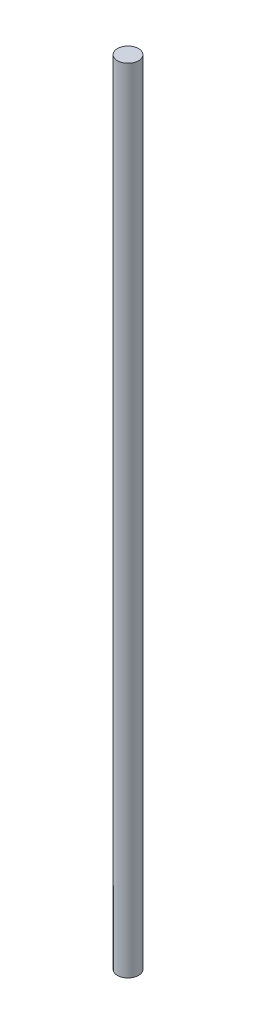
ISO-10303-21;
HEADER;
FILE_DESCRIPTION(('STEP AP214'),'2;1');
FILE_NAME('part.step','',(''),(''),'','','');
FILE_SCHEMA(('AUTOMOTIVE_DESIGN { 1 0 10303 214 1 1 1 1 }'));
ENDSEC;
DATA;
#1=APPLICATION_CONTEXT('core data for automotive mechanical design processes');
#2=APPLICATION_PROTOCOL_DEFINITION('international standard','automotive_design',2000,#1);
#3=PRODUCT_CONTEXT('',#1,'mechanical');
#4=PRODUCT('Part','Part','',(#3));
#5=PRODUCT_RELATED_PRODUCT_CATEGORY('part','',(#4));
#6=PRODUCT_DEFINITION_FORMATION('','',#4);
#7=PRODUCT_DEFINITION_CONTEXT('part definition',#1,'design');
#8=PRODUCT_DEFINITION('design','',#6,#7);
#9=PRODUCT_DEFINITION_SHAPE('','',#8);
#10=(LENGTH_UNIT() NAMED_UNIT(*) SI_UNIT(.MILLI.,.METRE.));
#11=(NAMED_UNIT(*) PLANE_ANGLE_UNIT() SI_UNIT($,.RADIAN.));
#12=(NAMED_UNIT(*) SI_UNIT($,.STERADIAN.) SOLID_ANGLE_UNIT());
#13=UNCERTAINTY_MEASURE_WITH_UNIT(LENGTH_MEASURE(1.E-05),#10,'distance_accuracy_value','');
#14=(GEOMETRIC_REPRESENTATION_CONTEXT(3) GLOBAL_UNCERTAINTY_ASSIGNED_CONTEXT((#13)) GLOBAL_UNIT_ASSIGNED_CONTEXT((#10,
#11,#12)) REPRESENTATION_CONTEXT('',''));
#15=CARTESIAN_POINT('',(0.,0.,0.));
#16=DIRECTION('',(0.,0.,1.));
#17=DIRECTION('',(1.,0.,0.));
#18=AXIS2_PLACEMENT_3D('',#15,#16,#17);
#19=CARTESIAN_POINT('',(0.,120.,0.));
#20=DIRECTION('',(0.,-1.,0.));
#21=DIRECTION('',(0.,0.,-1.));
#22=AXIS2_PLACEMENT_3D('',#19,#20,#21);
#23=CYLINDRICAL_SURFACE('',#22,1.6);
#24=CARTESIAN_POINT('',(0.,120.,0.));
#25=DIRECTION('',(0.,1.,0.));
#26=DIRECTION('',(0.,0.,1.));
#27=AXIS2_PLACEMENT_3D('',#24,#25,#26);
#28=CIRCLE('',#27,1.6);
#29=CARTESIAN_POINT('',(0.,120.,1.6));
#30=VERTEX_POINT('',#29);
#31=EDGE_CURVE('E10',#30,#30,#28,.T.);
#32=ORIENTED_EDGE('',*,*,#31,.F.);
#33=EDGE_LOOP('',(#32));
#34=FACE_BOUND('',#33,.T.);
#35=CARTESIAN_POINT('',(0.,0.,0.));
#36=DIRECTION('',(0.,1.,0.));
#37=DIRECTION('',(0.,0.,1.));
#38=AXIS2_PLACEMENT_3D('',#35,#36,#37);
#39=CIRCLE('',#38,1.6);
#40=CARTESIAN_POINT('',(0.,0.,1.6));
#41=VERTEX_POINT('',#40);
#42=EDGE_CURVE('E34',#41,#41,#39,.T.);
#43=ORIENTED_EDGE('',*,*,#42,.T.);
#44=EDGE_LOOP('',(#43));
#45=FACE_BOUND('',#44,.T.);
#46=ADVANCED_FACE('F31',(#34,#45),#23,.T.);
#47=CARTESIAN_POINT('',(0.,120.,0.));
#48=DIRECTION('',(0.,1.,0.));
#49=DIRECTION('',(0.,0.,1.));
#50=AXIS2_PLACEMENT_3D('',#47,#48,#49);
#51=PLANE('',#50);
#52=ORIENTED_EDGE('',*,*,#31,.T.);
#53=EDGE_LOOP('',(#52));
#54=FACE_BOUND('',#53,.T.);
#55=ADVANCED_FACE('F46',(#54),#51,.T.);
#56=CARTESIAN_POINT('',(0.,0.,0.));
#57=DIRECTION('',(0.,1.,0.));
#58=DIRECTION('',(0.,0.,1.));
#59=AXIS2_PLACEMENT_3D('',#56,#57,#58);
#60=PLANE('',#59);
#61=ORIENTED_EDGE('',*,*,#42,.F.);
#62=EDGE_LOOP('',(#61));
#63=FACE_BOUND('',#62,.T.);
#64=ADVANCED_FACE('F44',(#63),#60,.F.);
#65=CLOSED_SHELL('',(#46,#55,#64));
#66=MANIFOLD_SOLID_BREP('B2',#65);
#67=ADVANCED_BREP_SHAPE_REPRESENTATION('',(#18,#66),#14);
#68=SHAPE_DEFINITION_REPRESENTATION(#9,#67);
ENDSEC;
END-ISO-10303-21;
